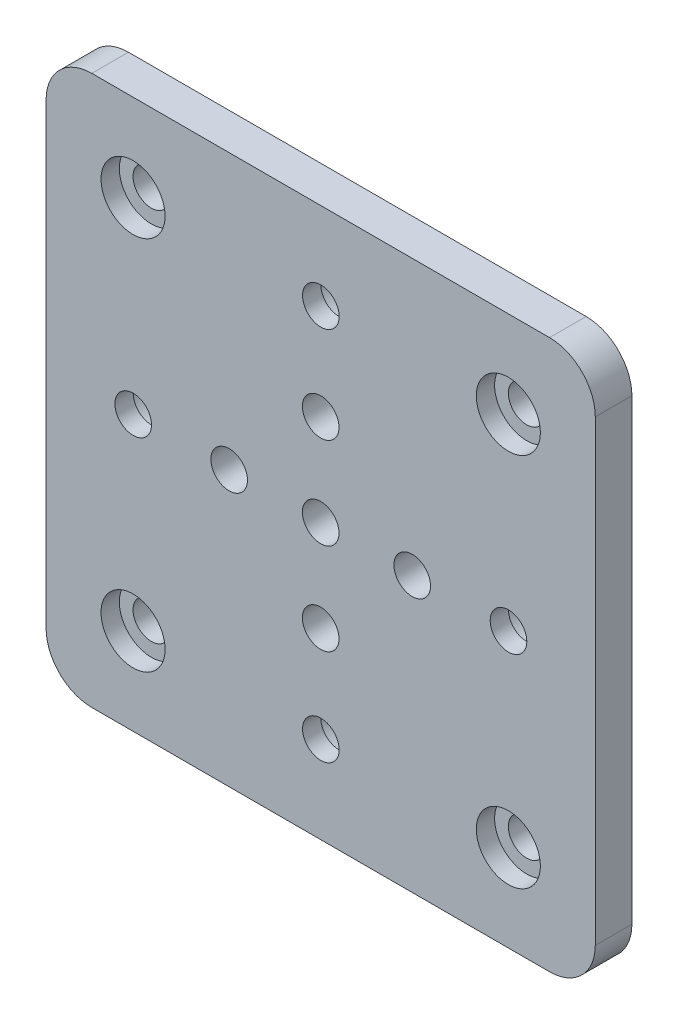
ISO-10303-21;
HEADER;
FILE_DESCRIPTION(('STEP AP214'),'2;1');
FILE_NAME('part.step','',(''),(''),'','','');
FILE_SCHEMA(('AUTOMOTIVE_DESIGN { 1 0 10303 214 1 1 1 1 }'));
ENDSEC;
DATA;
#1=APPLICATION_CONTEXT('core data for automotive mechanical design processes');
#2=APPLICATION_PROTOCOL_DEFINITION('international standard','automotive_design',2000,#1);
#3=PRODUCT_CONTEXT('',#1,'mechanical');
#4=PRODUCT('Part','Part','',(#3));
#5=PRODUCT_RELATED_PRODUCT_CATEGORY('part','',(#4));
#6=PRODUCT_DEFINITION_FORMATION('','',#4);
#7=PRODUCT_DEFINITION_CONTEXT('part definition',#1,'design');
#8=PRODUCT_DEFINITION('design','',#6,#7);
#9=PRODUCT_DEFINITION_SHAPE('','',#8);
#10=(LENGTH_UNIT() NAMED_UNIT(*) SI_UNIT(.MILLI.,.METRE.));
#11=(NAMED_UNIT(*) PLANE_ANGLE_UNIT() SI_UNIT($,.RADIAN.));
#12=(NAMED_UNIT(*) SI_UNIT($,.STERADIAN.) SOLID_ANGLE_UNIT());
#13=UNCERTAINTY_MEASURE_WITH_UNIT(LENGTH_MEASURE(1.E-05),#10,'distance_accuracy_value','');
#14=(GEOMETRIC_REPRESENTATION_CONTEXT(3) GLOBAL_UNCERTAINTY_ASSIGNED_CONTEXT((#13)) GLOBAL_UNIT_ASSIGNED_CONTEXT((#10,
#11,#12)) REPRESENTATION_CONTEXT('',''));
#15=CARTESIAN_POINT('',(0.,0.,0.));
#16=DIRECTION('',(0.,0.,1.));
#17=DIRECTION('',(1.,0.,0.));
#18=AXIS2_PLACEMENT_3D('',#15,#16,#17);
#19=CARTESIAN_POINT('',(20.5000070998357,0.,4.));
#20=DIRECTION('',(0.,0.,-1.));
#21=DIRECTION('',(-1.,0.,0.));
#22=AXIS2_PLACEMENT_3D('',#19,#20,#21);
#23=CYLINDRICAL_SURFACE('',#22,2.);
#24=CARTESIAN_POINT('',(20.5000070998357,0.,4.));
#25=DIRECTION('',(0.,0.,1.));
#26=DIRECTION('',(1.,0.,0.));
#27=AXIS2_PLACEMENT_3D('',#24,#25,#26);
#28=CIRCLE('',#27,2.);
#29=CARTESIAN_POINT('',(22.5000070998357,0.,4.));
#30=VERTEX_POINT('',#29);
#31=EDGE_CURVE('E155',#30,#30,#28,.T.);
#32=ORIENTED_EDGE('',*,*,#31,.T.);
#33=EDGE_LOOP('',(#32));
#34=FACE_BOUND('',#33,.T.);
#35=CARTESIAN_POINT('',(20.5000070998357,0.,2.));
#36=DIRECTION('',(0.,0.,-1.));
#37=DIRECTION('',(-1.,0.,0.));
#38=AXIS2_PLACEMENT_3D('',#35,#36,#37);
#39=CIRCLE('',#38,2.);
#40=CARTESIAN_POINT('',(18.5000070998357,0.,2.));
#41=VERTEX_POINT('',#40);
#42=EDGE_CURVE('E49',#41,#41,#39,.T.);
#43=ORIENTED_EDGE('',*,*,#42,.T.);
#44=EDGE_LOOP('',(#43));
#45=FACE_BOUND('',#44,.T.);
#46=ADVANCED_FACE('F45',(#34,#45),#23,.F.);
#47=CARTESIAN_POINT('',(0.,-20.5000070998356,4.));
#48=DIRECTION('',(0.,0.,-1.));
#49=DIRECTION('',(-1.,0.,0.));
#50=AXIS2_PLACEMENT_3D('',#47,#48,#49);
#51=CYLINDRICAL_SURFACE('',#50,2.);
#52=CARTESIAN_POINT('',(0.,-20.5000070998356,4.));
#53=DIRECTION('',(0.,0.,1.));
#54=DIRECTION('',(1.,0.,0.));
#55=AXIS2_PLACEMENT_3D('',#52,#53,#54);
#56=CIRCLE('',#55,2.);
#57=CARTESIAN_POINT('',(2.,-20.5000070998356,4.));
#58=VERTEX_POINT('',#57);
#59=EDGE_CURVE('E310',#58,#58,#56,.T.);
#60=ORIENTED_EDGE('',*,*,#59,.T.);
#61=EDGE_LOOP('',(#60));
#62=FACE_BOUND('',#61,.T.);
#63=CARTESIAN_POINT('',(0.,-20.5000070998356,2.));
#64=DIRECTION('',(0.,0.,-1.));
#65=DIRECTION('',(-1.,0.,0.));
#66=AXIS2_PLACEMENT_3D('',#63,#64,#65);
#67=CIRCLE('',#66,2.);
#68=CARTESIAN_POINT('',(-2.,-20.5000070998356,2.));
#69=VERTEX_POINT('',#68);
#70=EDGE_CURVE('E217',#69,#69,#67,.T.);
#71=ORIENTED_EDGE('',*,*,#70,.T.);
#72=EDGE_LOOP('',(#71));
#73=FACE_BOUND('',#72,.T.);
#74=ADVANCED_FACE('F433',(#62,#73),#51,.F.);
#75=CARTESIAN_POINT('',(0.,20.4999929001644,4.));
#76=DIRECTION('',(0.,0.,-1.));
#77=DIRECTION('',(-1.,0.,0.));
#78=AXIS2_PLACEMENT_3D('',#75,#76,#77);
#79=CYLINDRICAL_SURFACE('',#78,2.);
#80=CARTESIAN_POINT('',(0.,20.4999929001644,4.));
#81=DIRECTION('',(0.,0.,1.));
#82=DIRECTION('',(1.,0.,0.));
#83=AXIS2_PLACEMENT_3D('',#80,#81,#82);
#84=CIRCLE('',#83,2.);
#85=CARTESIAN_POINT('',(2.,20.4999929001644,4.));
#86=VERTEX_POINT('',#85);
#87=EDGE_CURVE('E302',#86,#86,#84,.T.);
#88=ORIENTED_EDGE('',*,*,#87,.T.);
#89=EDGE_LOOP('',(#88));
#90=FACE_BOUND('',#89,.T.);
#91=CARTESIAN_POINT('',(0.,20.4999929001644,2.));
#92=DIRECTION('',(0.,0.,-1.));
#93=DIRECTION('',(-1.,0.,0.));
#94=AXIS2_PLACEMENT_3D('',#91,#92,#93);
#95=CIRCLE('',#94,2.);
#96=CARTESIAN_POINT('',(-2.,20.4999929001644,2.));
#97=VERTEX_POINT('',#96);
#98=EDGE_CURVE('E213',#97,#97,#95,.T.);
#99=ORIENTED_EDGE('',*,*,#98,.T.);
#100=EDGE_LOOP('',(#99));
#101=FACE_BOUND('',#100,.T.);
#102=ADVANCED_FACE('F440',(#90,#101),#79,.F.);
#103=CARTESIAN_POINT('',(-20.5,0.,4.));
#104=DIRECTION('',(0.,0.,-1.));
#105=DIRECTION('',(-1.,0.,0.));
#106=AXIS2_PLACEMENT_3D('',#103,#104,#105);
#107=CYLINDRICAL_SURFACE('',#106,2.);
#108=CARTESIAN_POINT('',(-20.5,0.,4.));
#109=DIRECTION('',(0.,0.,1.));
#110=DIRECTION('',(1.,0.,0.));
#111=AXIS2_PLACEMENT_3D('',#108,#109,#110);
#112=CIRCLE('',#111,2.);
#113=CARTESIAN_POINT('',(-18.5,0.,4.));
#114=VERTEX_POINT('',#113);
#115=EDGE_CURVE('E295',#114,#114,#112,.T.);
#116=ORIENTED_EDGE('',*,*,#115,.T.);
#117=EDGE_LOOP('',(#116));
#118=FACE_BOUND('',#117,.T.);
#119=CARTESIAN_POINT('',(-20.5,0.,2.));
#120=DIRECTION('',(0.,0.,-1.));
#121=DIRECTION('',(-1.,0.,0.));
#122=AXIS2_PLACEMENT_3D('',#119,#120,#121);
#123=CIRCLE('',#122,2.);
#124=CARTESIAN_POINT('',(-22.5,0.,2.));
#125=VERTEX_POINT('',#124);
#126=EDGE_CURVE('E209',#125,#125,#123,.T.);
#127=ORIENTED_EDGE('',*,*,#126,.T.);
#128=EDGE_LOOP('',(#127));
#129=FACE_BOUND('',#128,.T.);
#130=ADVANCED_FACE('F604',(#118,#129),#107,.F.);
#131=CARTESIAN_POINT('',(-20.5170614570448,20.4999929001644,4.));
#132=DIRECTION('',(0.,0.,-1.));
#133=DIRECTION('',(-1.,0.,0.));
#134=AXIS2_PLACEMENT_3D('',#131,#132,#133);
#135=CYLINDRICAL_SURFACE('',#134,2.);
#136=CARTESIAN_POINT('',(-20.5170614570448,20.4999929001644,0.));
#137=DIRECTION('',(0.,0.,1.));
#138=DIRECTION('',(1.,0.,0.));
#139=AXIS2_PLACEMENT_3D('',#136,#137,#138);
#140=CIRCLE('',#139,2.);
#141=CARTESIAN_POINT('',(-18.5170614570448,20.4999929001644,0.));
#142=VERTEX_POINT('',#141);
#143=EDGE_CURVE('E306',#142,#142,#140,.T.);
#144=ORIENTED_EDGE('',*,*,#143,.F.);
#145=EDGE_LOOP('',(#144));
#146=FACE_BOUND('',#145,.T.);
#147=CARTESIAN_POINT('',(-20.5170614570448,20.4999929001644,2.));
#148=DIRECTION('',(0.,0.,1.));
#149=DIRECTION('',(1.,0.,0.));
#150=AXIS2_PLACEMENT_3D('',#147,#148,#149);
#151=CIRCLE('',#150,2.);
#152=CARTESIAN_POINT('',(-18.5170614570448,20.4999929001644,2.));
#153=VERTEX_POINT('',#152);
#154=EDGE_CURVE('E204',#153,#153,#151,.T.);
#155=ORIENTED_EDGE('',*,*,#154,.T.);
#156=EDGE_LOOP('',(#155));
#157=FACE_BOUND('',#156,.T.);
#158=ADVANCED_FACE('F596',(#146,#157),#135,.F.);
#159=CARTESIAN_POINT('',(20.4829385429551,-20.5000070998357,4.));
#160=DIRECTION('',(0.,0.,-1.));
#161=DIRECTION('',(-1.,0.,0.));
#162=AXIS2_PLACEMENT_3D('',#159,#160,#161);
#163=CYLINDRICAL_SURFACE('',#162,2.);
#164=CARTESIAN_POINT('',(20.4829385429551,-20.5000070998357,0.));
#165=DIRECTION('',(0.,0.,1.));
#166=DIRECTION('',(-1.,0.,0.));
#167=AXIS2_PLACEMENT_3D('',#164,#165,#166);
#168=CIRCLE('',#167,2.);
#169=CARTESIAN_POINT('',(18.4829385429551,-20.5000070998357,0.));
#170=VERTEX_POINT('',#169);
#171=EDGE_CURVE('E278',#170,#170,#168,.T.);
#172=ORIENTED_EDGE('',*,*,#171,.F.);
#173=EDGE_LOOP('',(#172));
#174=FACE_BOUND('',#173,.T.);
#175=CARTESIAN_POINT('',(20.4829385429551,-20.5000070998357,2.));
#176=DIRECTION('',(0.,0.,1.));
#177=DIRECTION('',(1.,0.,0.));
#178=AXIS2_PLACEMENT_3D('',#175,#176,#177);
#179=CIRCLE('',#178,2.);
#180=CARTESIAN_POINT('',(22.4829385429551,-20.5000070998357,2.));
#181=VERTEX_POINT('',#180);
#182=EDGE_CURVE('E200',#181,#181,#179,.T.);
#183=ORIENTED_EDGE('',*,*,#182,.T.);
#184=EDGE_LOOP('',(#183));
#185=FACE_BOUND('',#184,.T.);
#186=ADVANCED_FACE('F587',(#174,#185),#163,.F.);
#187=CARTESIAN_POINT('',(20.4829385429551,20.4999929001644,4.));
#188=DIRECTION('',(0.,0.,-1.));
#189=DIRECTION('',(-1.,0.,0.));
#190=AXIS2_PLACEMENT_3D('',#187,#188,#189);
#191=CYLINDRICAL_SURFACE('',#190,2.);
#192=CARTESIAN_POINT('',(20.4829385429551,20.4999929001644,0.));
#193=DIRECTION('',(0.,0.,1.));
#194=DIRECTION('',(1.,0.,0.));
#195=AXIS2_PLACEMENT_3D('',#192,#193,#194);
#196=CIRCLE('',#195,2.);
#197=CARTESIAN_POINT('',(22.4829385429551,20.4999929001644,0.));
#198=VERTEX_POINT('',#197);
#199=EDGE_CURVE('E274',#198,#198,#196,.T.);
#200=ORIENTED_EDGE('',*,*,#199,.F.);
#201=EDGE_LOOP('',(#200));
#202=FACE_BOUND('',#201,.T.);
#203=CARTESIAN_POINT('',(20.4829385429551,20.4999929001644,2.));
#204=DIRECTION('',(0.,0.,1.));
#205=DIRECTION('',(1.,0.,0.));
#206=AXIS2_PLACEMENT_3D('',#203,#204,#205);
#207=CIRCLE('',#206,2.);
#208=CARTESIAN_POINT('',(22.4829385429551,20.4999929001644,2.));
#209=VERTEX_POINT('',#208);
#210=EDGE_CURVE('E195',#209,#209,#207,.T.);
#211=ORIENTED_EDGE('',*,*,#210,.T.);
#212=EDGE_LOOP('',(#211));
#213=FACE_BOUND('',#212,.T.);
#214=ADVANCED_FACE('F578',(#202,#213),#191,.F.);
#215=CARTESIAN_POINT('',(-20.5170614570448,-20.5000070998356,4.));
#216=DIRECTION('',(0.,0.,-1.));
#217=DIRECTION('',(-1.,0.,0.));
#218=AXIS2_PLACEMENT_3D('',#215,#216,#217);
#219=CYLINDRICAL_SURFACE('',#218,2.);
#220=CARTESIAN_POINT('',(-20.5170614570448,-20.5000070998356,0.));
#221=DIRECTION('',(0.,0.,1.));
#222=DIRECTION('',(-1.,0.,0.));
#223=AXIS2_PLACEMENT_3D('',#220,#221,#222);
#224=CIRCLE('',#223,2.);
#225=CARTESIAN_POINT('',(-22.5170614570448,-20.5000070998356,0.));
#226=VERTEX_POINT('',#225);
#227=EDGE_CURVE('E267',#226,#226,#224,.T.);
#228=ORIENTED_EDGE('',*,*,#227,.F.);
#229=EDGE_LOOP('',(#228));
#230=FACE_BOUND('',#229,.T.);
#231=CARTESIAN_POINT('',(-20.5170614570448,-20.5000070998356,2.));
#232=DIRECTION('',(0.,0.,1.));
#233=DIRECTION('',(1.,0.,0.));
#234=AXIS2_PLACEMENT_3D('',#231,#232,#233);
#235=CIRCLE('',#234,2.);
#236=CARTESIAN_POINT('',(-18.5170614570448,-20.5000070998356,2.));
#237=VERTEX_POINT('',#236);
#238=EDGE_CURVE('E191',#237,#237,#235,.T.);
#239=ORIENTED_EDGE('',*,*,#238,.T.);
#240=EDGE_LOOP('',(#239));
#241=FACE_BOUND('',#240,.T.);
#242=ADVANCED_FACE('F446',(#230,#241),#219,.F.);
#243=CARTESIAN_POINT('',(24.9829385429552,-25.0000070998356,4.));
#244=DIRECTION('',(0.,0.,1.));
#245=DIRECTION('',(1.,0.,0.));
#246=AXIS2_PLACEMENT_3D('',#243,#244,#245);
#247=PLANE('',#246);
#248=CARTESIAN_POINT('',(20.4829385429551,20.4999929001644,4.));
#249=DIRECTION('',(0.,0.,1.));
#250=DIRECTION('',(1.,0.,0.));
#251=AXIS2_PLACEMENT_3D('',#248,#249,#250);
#252=CIRCLE('',#251,3.5);
#253=CARTESIAN_POINT('',(23.9829385429552,20.4999929001644,4.));
#254=VERTEX_POINT('',#253);
#255=EDGE_CURVE('E229',#254,#254,#252,.T.);
#256=ORIENTED_EDGE('',*,*,#255,.F.);
#257=EDGE_LOOP('',(#256));
#258=FACE_BOUND('',#257,.T.);
#259=CARTESIAN_POINT('',(20.4829385429551,-20.5000070998357,4.));
#260=DIRECTION('',(0.,0.,1.));
#261=DIRECTION('',(1.,0.,0.));
#262=AXIS2_PLACEMENT_3D('',#259,#260,#261);
#263=CIRCLE('',#262,3.5);
#264=CARTESIAN_POINT('',(23.9829385429552,-20.5000070998357,4.));
#265=VERTEX_POINT('',#264);
#266=EDGE_CURVE('E334',#265,#265,#263,.T.);
#267=ORIENTED_EDGE('',*,*,#266,.F.);
#268=EDGE_LOOP('',(#267));
#269=FACE_BOUND('',#268,.T.);
#270=CARTESIAN_POINT('',(-20.5170614570448,-20.5000070998356,4.));
#271=DIRECTION('',(0.,0.,1.));
#272=DIRECTION('',(1.,0.,0.));
#273=AXIS2_PLACEMENT_3D('',#270,#271,#272);
#274=CIRCLE('',#273,3.5);
#275=CARTESIAN_POINT('',(-17.0170614570448,-20.5000070998356,4.));
#276=VERTEX_POINT('',#275);
#277=EDGE_CURVE('E246',#276,#276,#274,.T.);
#278=ORIENTED_EDGE('',*,*,#277,.F.);
#279=EDGE_LOOP('',(#278));
#280=FACE_BOUND('',#279,.T.);
#281=CARTESIAN_POINT('',(-20.5170614570448,20.4999929001644,4.));
#282=DIRECTION('',(0.,0.,1.));
#283=DIRECTION('',(1.,0.,0.));
#284=AXIS2_PLACEMENT_3D('',#281,#282,#283);
#285=CIRCLE('',#284,3.5);
#286=CARTESIAN_POINT('',(-17.0170614570448,20.4999929001644,4.));
#287=VERTEX_POINT('',#286);
#288=EDGE_CURVE('E242',#287,#287,#285,.T.);
#289=ORIENTED_EDGE('',*,*,#288,.F.);
#290=EDGE_LOOP('',(#289));
#291=FACE_BOUND('',#290,.T.);
#292=CARTESIAN_POINT('',(9.98293854295517,0.,4.));
#293=DIRECTION('',(0.,0.,1.));
#294=DIRECTION('',(1.,0.,0.));
#295=AXIS2_PLACEMENT_3D('',#292,#293,#294);
#296=CIRCLE('',#295,2.);
#297=CARTESIAN_POINT('',(11.9829385429552,0.,4.));
#298=VERTEX_POINT('',#297);
#299=EDGE_CURVE('E255',#298,#298,#296,.T.);
#300=ORIENTED_EDGE('',*,*,#299,.F.);
#301=EDGE_LOOP('',(#300));
#302=FACE_BOUND('',#301,.T.);
#303=CARTESIAN_POINT('',(-10.0170614570448,0.,4.));
#304=DIRECTION('',(0.,0.,1.));
#305=DIRECTION('',(1.,0.,0.));
#306=AXIS2_PLACEMENT_3D('',#303,#304,#305);
#307=CIRCLE('',#306,2.);
#308=CARTESIAN_POINT('',(-8.01706145704483,0.,4.));
#309=VERTEX_POINT('',#308);
#310=EDGE_CURVE('E291',#309,#309,#307,.T.);
#311=ORIENTED_EDGE('',*,*,#310,.F.);
#312=EDGE_LOOP('',(#311));
#313=FACE_BOUND('',#312,.T.);
#314=ORIENTED_EDGE('',*,*,#87,.F.);
#315=EDGE_LOOP('',(#314));
#316=FACE_BOUND('',#315,.T.);
#317=ORIENTED_EDGE('',*,*,#59,.F.);
#318=EDGE_LOOP('',(#317));
#319=FACE_BOUND('',#318,.T.);
#320=CARTESIAN_POINT('',(24.9829385429552,-25.0000070998356,4.));
#321=DIRECTION('',(0.,0.,1.));
#322=DIRECTION('',(1.,0.,0.));
#323=AXIS2_PLACEMENT_3D('',#320,#321,#322);
#324=CIRCLE('',#323,5.);
#325=CARTESIAN_POINT('',(24.9829385429552,-30.0000070998356,4.));
#326=VERTEX_POINT('',#325);
#327=CARTESIAN_POINT('',(29.9829385429552,-25.0000070998356,4.));
#328=VERTEX_POINT('',#327);
#329=EDGE_CURVE('E173',#326,#328,#324,.T.);
#330=ORIENTED_EDGE('',*,*,#329,.T.);
#331=DIRECTION('',(0.,1.,0.));
#332=VECTOR('',#331,1.);
#333=CARTESIAN_POINT('',(29.9829385429552,-25.0000070998356,4.));
#334=LINE('',#333,#332);
#335=CARTESIAN_POINT('',(29.9829385429552,24.9999929001644,4.));
#336=VERTEX_POINT('',#335);
#337=EDGE_CURVE('E108',#328,#336,#334,.T.);
#338=ORIENTED_EDGE('',*,*,#337,.T.);
#339=CARTESIAN_POINT('',(24.9829385429552,24.9999929001644,4.));
#340=DIRECTION('',(0.,0.,1.));
#341=DIRECTION('',(1.,0.,0.));
#342=AXIS2_PLACEMENT_3D('',#339,#340,#341);
#343=CIRCLE('',#342,5.);
#344=CARTESIAN_POINT('',(24.9829385429552,29.9999929001644,4.));
#345=VERTEX_POINT('',#344);
#346=EDGE_CURVE('E321',#336,#345,#343,.T.);
#347=ORIENTED_EDGE('',*,*,#346,.T.);
#348=DIRECTION('',(-1.,0.,0.));
#349=VECTOR('',#348,1.);
#350=CARTESIAN_POINT('',(24.9829385429552,29.9999929001644,4.));
#351=LINE('',#350,#349);
#352=CARTESIAN_POINT('',(-25.0170614570448,29.9999929001644,4.));
#353=VERTEX_POINT('',#352);
#354=EDGE_CURVE('E324',#345,#353,#351,.T.);
#355=ORIENTED_EDGE('',*,*,#354,.T.);
#356=CARTESIAN_POINT('',(-25.0170614570448,24.9999929001644,4.));
#357=DIRECTION('',(0.,0.,1.));
#358=DIRECTION('',(1.,0.,0.));
#359=AXIS2_PLACEMENT_3D('',#356,#357,#358);
#360=CIRCLE('',#359,5.);
#361=CARTESIAN_POINT('',(-30.0170614570448,24.9999929001644,4.));
#362=VERTEX_POINT('',#361);
#363=EDGE_CURVE('E128',#353,#362,#360,.T.);
#364=ORIENTED_EDGE('',*,*,#363,.T.);
#365=DIRECTION('',(0.,-1.,0.));
#366=VECTOR('',#365,1.);
#367=CARTESIAN_POINT('',(-30.0170614570448,24.9999929001644,4.));
#368=LINE('',#367,#366);
#369=CARTESIAN_POINT('',(-30.0170614570448,-25.0000070998357,4.));
#370=VERTEX_POINT('',#369);
#371=EDGE_CURVE('E121',#362,#370,#368,.T.);
#372=ORIENTED_EDGE('',*,*,#371,.T.);
#373=CARTESIAN_POINT('',(-25.0170614570448,-25.0000070998357,4.));
#374=DIRECTION('',(0.,0.,1.));
#375=DIRECTION('',(1.,0.,0.));
#376=AXIS2_PLACEMENT_3D('',#373,#374,#375);
#377=CIRCLE('',#376,4.99999999999999);
#378=CARTESIAN_POINT('',(-25.0170614570448,-30.0000070998356,4.));
#379=VERTEX_POINT('',#378);
#380=EDGE_CURVE('E126',#370,#379,#377,.T.);
#381=ORIENTED_EDGE('',*,*,#380,.T.);
#382=DIRECTION('',(1.,0.,0.));
#383=VECTOR('',#382,1.);
#384=CARTESIAN_POINT('',(-25.0170614570448,-30.0000070998356,4.));
#385=LINE('',#384,#383);
#386=EDGE_CURVE('E65',#379,#326,#385,.T.);
#387=ORIENTED_EDGE('',*,*,#386,.T.);
#388=EDGE_LOOP('',(#330,#338,#347,#355,#364,#372,#381,#387));
#389=FACE_BOUND('',#388,.T.);
#390=ORIENTED_EDGE('',*,*,#31,.F.);
#391=EDGE_LOOP('',(#390));
#392=FACE_BOUND('',#391,.T.);
#393=ORIENTED_EDGE('',*,*,#115,.F.);
#394=EDGE_LOOP('',(#393));
#395=FACE_BOUND('',#394,.T.);
#396=CARTESIAN_POINT('',(-0.0170614570448352,0.,4.));
#397=DIRECTION('',(0.,0.,1.));
#398=DIRECTION('',(1.,0.,0.));
#399=AXIS2_PLACEMENT_3D('',#396,#397,#398);
#400=CIRCLE('',#399,2.);
#401=CARTESIAN_POINT('',(1.98293854295516,0.,4.));
#402=VERTEX_POINT('',#401);
#403=EDGE_CURVE('E283',#402,#402,#400,.T.);
#404=ORIENTED_EDGE('',*,*,#403,.F.);
#405=EDGE_LOOP('',(#404));
#406=FACE_BOUND('',#405,.T.);
#407=CARTESIAN_POINT('',(-0.0170614570448326,10.,4.));
#408=DIRECTION('',(0.,0.,1.));
#409=DIRECTION('',(1.,0.,0.));
#410=AXIS2_PLACEMENT_3D('',#407,#408,#409);
#411=CIRCLE('',#410,2.);
#412=CARTESIAN_POINT('',(1.98293854295517,10.,4.));
#413=VERTEX_POINT('',#412);
#414=EDGE_CURVE('E263',#413,#413,#411,.T.);
#415=ORIENTED_EDGE('',*,*,#414,.F.);
#416=EDGE_LOOP('',(#415));
#417=FACE_BOUND('',#416,.T.);
#418=CARTESIAN_POINT('',(-0.0170614570448326,-10.,4.));
#419=DIRECTION('',(0.,0.,1.));
#420=DIRECTION('',(1.,0.,0.));
#421=AXIS2_PLACEMENT_3D('',#418,#419,#420);
#422=CIRCLE('',#421,2.);
#423=CARTESIAN_POINT('',(1.98293854295517,-10.,4.));
#424=VERTEX_POINT('',#423);
#425=EDGE_CURVE('E247',#424,#424,#422,.T.);
#426=ORIENTED_EDGE('',*,*,#425,.F.);
#427=EDGE_LOOP('',(#426));
#428=FACE_BOUND('',#427,.T.);
#429=ADVANCED_FACE('F123',(#258,#269,#280,#291,#302,#313,#316,#319,#389,#392,#395,#406,#417,
#428),#247,.T.);
#430=CARTESIAN_POINT('',(24.9829385429552,-25.0000070998356,0.));
#431=DIRECTION('',(0.,0.,1.));
#432=DIRECTION('',(1.,0.,0.));
#433=AXIS2_PLACEMENT_3D('',#430,#431,#432);
#434=PLANE('',#433);
#435=CARTESIAN_POINT('',(20.5000070998357,0.,0.));
#436=DIRECTION('',(0.,0.,-1.));
#437=DIRECTION('',(-1.,0.,0.));
#438=AXIS2_PLACEMENT_3D('',#435,#436,#437);
#439=CIRCLE('',#438,3.5);
#440=CARTESIAN_POINT('',(17.0000070998357,0.,0.));
#441=VERTEX_POINT('',#440);
#442=EDGE_CURVE('E367',#441,#441,#439,.T.);
#443=ORIENTED_EDGE('',*,*,#442,.F.);
#444=EDGE_LOOP('',(#443));
#445=FACE_BOUND('',#444,.T.);
#446=CARTESIAN_POINT('',(-20.5,0.,0.));
#447=DIRECTION('',(0.,0.,-1.));
#448=DIRECTION('',(-1.,0.,0.));
#449=AXIS2_PLACEMENT_3D('',#446,#447,#448);
#450=CIRCLE('',#449,3.5);
#451=CARTESIAN_POINT('',(-24.,0.,0.));
#452=VERTEX_POINT('',#451);
#453=EDGE_CURVE('E363',#452,#452,#450,.T.);
#454=ORIENTED_EDGE('',*,*,#453,.F.);
#455=EDGE_LOOP('',(#454));
#456=FACE_BOUND('',#455,.T.);
#457=CARTESIAN_POINT('',(0.,20.4999929001644,0.));
#458=DIRECTION('',(0.,0.,-1.));
#459=DIRECTION('',(-1.,0.,0.));
#460=AXIS2_PLACEMENT_3D('',#457,#458,#459);
#461=CIRCLE('',#460,3.5);
#462=CARTESIAN_POINT('',(-3.5,20.4999929001644,0.));
#463=VERTEX_POINT('',#462);
#464=EDGE_CURVE('E355',#463,#463,#461,.T.);
#465=ORIENTED_EDGE('',*,*,#464,.F.);
#466=EDGE_LOOP('',(#465));
#467=FACE_BOUND('',#466,.T.);
#468=CARTESIAN_POINT('',(0.,-20.5000070998356,0.));
#469=DIRECTION('',(0.,0.,-1.));
#470=DIRECTION('',(-1.,0.,0.));
#471=AXIS2_PLACEMENT_3D('',#468,#469,#470);
#472=CIRCLE('',#471,3.5);
#473=CARTESIAN_POINT('',(-3.5,-20.5000070998356,0.));
#474=VERTEX_POINT('',#473);
#475=EDGE_CURVE('E347',#474,#474,#472,.T.);
#476=ORIENTED_EDGE('',*,*,#475,.F.);
#477=EDGE_LOOP('',(#476));
#478=FACE_BOUND('',#477,.T.);
#479=CARTESIAN_POINT('',(24.9829385429552,-25.0000070998356,0.));
#480=DIRECTION('',(0.,0.,1.));
#481=DIRECTION('',(1.,0.,0.));
#482=AXIS2_PLACEMENT_3D('',#479,#480,#481);
#483=CIRCLE('',#482,5.);
#484=CARTESIAN_POINT('',(24.9829385429552,-30.0000070998356,0.));
#485=VERTEX_POINT('',#484);
#486=CARTESIAN_POINT('',(29.9829385429552,-25.0000070998356,0.));
#487=VERTEX_POINT('',#486);
#488=EDGE_CURVE('E150',#485,#487,#483,.T.);
#489=ORIENTED_EDGE('',*,*,#488,.F.);
#490=DIRECTION('',(1.,0.,0.));
#491=VECTOR('',#490,1.);
#492=CARTESIAN_POINT('',(-25.0170614570448,-30.0000070998356,0.));
#493=LINE('',#492,#491);
#494=CARTESIAN_POINT('',(-25.0170614570448,-30.0000070998356,0.));
#495=VERTEX_POINT('',#494);
#496=EDGE_CURVE('E100',#495,#485,#493,.T.);
#497=ORIENTED_EDGE('',*,*,#496,.F.);
#498=CARTESIAN_POINT('',(-25.0170614570448,-25.0000070998357,0.));
#499=DIRECTION('',(0.,0.,1.));
#500=DIRECTION('',(1.,0.,0.));
#501=AXIS2_PLACEMENT_3D('',#498,#499,#500);
#502=CIRCLE('',#501,4.99999999999999);
#503=CARTESIAN_POINT('',(-30.0170614570448,-25.0000070998357,0.));
#504=VERTEX_POINT('',#503);
#505=EDGE_CURVE('E94',#504,#495,#502,.T.);
#506=ORIENTED_EDGE('',*,*,#505,.F.);
#507=DIRECTION('',(0.,-1.,0.));
#508=VECTOR('',#507,1.);
#509=CARTESIAN_POINT('',(-30.0170614570448,24.9999929001644,0.));
#510=LINE('',#509,#508);
#511=CARTESIAN_POINT('',(-30.0170614570448,24.9999929001644,0.));
#512=VERTEX_POINT('',#511);
#513=EDGE_CURVE('E137',#512,#504,#510,.T.);
#514=ORIENTED_EDGE('',*,*,#513,.F.);
#515=CARTESIAN_POINT('',(-25.0170614570448,24.9999929001644,0.));
#516=DIRECTION('',(0.,0.,1.));
#517=DIRECTION('',(1.,0.,0.));
#518=AXIS2_PLACEMENT_3D('',#515,#516,#517);
#519=CIRCLE('',#518,5.);
#520=CARTESIAN_POINT('',(-25.0170614570448,29.9999929001644,0.));
#521=VERTEX_POINT('',#520);
#522=EDGE_CURVE('E164',#521,#512,#519,.T.);
#523=ORIENTED_EDGE('',*,*,#522,.F.);
#524=DIRECTION('',(-1.,0.,0.));
#525=VECTOR('',#524,1.);
#526=CARTESIAN_POINT('',(24.9829385429552,29.9999929001644,0.));
#527=LINE('',#526,#525);
#528=CARTESIAN_POINT('',(24.9829385429552,29.9999929001644,0.));
#529=VERTEX_POINT('',#528);
#530=EDGE_CURVE('E161',#529,#521,#527,.T.);
#531=ORIENTED_EDGE('',*,*,#530,.F.);
#532=CARTESIAN_POINT('',(24.9829385429552,24.9999929001644,0.));
#533=DIRECTION('',(0.,0.,1.));
#534=DIRECTION('',(1.,0.,0.));
#535=AXIS2_PLACEMENT_3D('',#532,#533,#534);
#536=CIRCLE('',#535,5.);
#537=CARTESIAN_POINT('',(29.9829385429552,24.9999929001644,0.));
#538=VERTEX_POINT('',#537);
#539=EDGE_CURVE('E158',#538,#529,#536,.T.);
#540=ORIENTED_EDGE('',*,*,#539,.F.);
#541=DIRECTION('',(0.,1.,0.));
#542=VECTOR('',#541,1.);
#543=CARTESIAN_POINT('',(29.9829385429552,-25.0000070998356,0.));
#544=LINE('',#543,#542);
#545=EDGE_CURVE('E154',#487,#538,#544,.T.);
#546=ORIENTED_EDGE('',*,*,#545,.F.);
#547=EDGE_LOOP('',(#489,#497,#506,#514,#523,#531,#540,#546));
#548=FACE_BOUND('',#547,.T.);
#549=ORIENTED_EDGE('',*,*,#143,.T.);
#550=EDGE_LOOP('',(#549));
#551=FACE_BOUND('',#550,.T.);
#552=CARTESIAN_POINT('',(-10.0170614570448,0.,0.));
#553=DIRECTION('',(0.,0.,1.));
#554=DIRECTION('',(1.,0.,0.));
#555=AXIS2_PLACEMENT_3D('',#552,#553,#554);
#556=CIRCLE('',#555,2.);
#557=CARTESIAN_POINT('',(-8.01706145704483,0.,0.));
#558=VERTEX_POINT('',#557);
#559=EDGE_CURVE('E287',#558,#558,#556,.T.);
#560=ORIENTED_EDGE('',*,*,#559,.T.);
#561=EDGE_LOOP('',(#560));
#562=FACE_BOUND('',#561,.T.);
#563=CARTESIAN_POINT('',(-0.0170614570448352,0.,0.));
#564=DIRECTION('',(0.,0.,1.));
#565=DIRECTION('',(1.,0.,0.));
#566=AXIS2_PLACEMENT_3D('',#563,#564,#565);
#567=CIRCLE('',#566,2.);
#568=CARTESIAN_POINT('',(1.98293854295516,0.,0.));
#569=VERTEX_POINT('',#568);
#570=EDGE_CURVE('E282',#569,#569,#567,.T.);
#571=ORIENTED_EDGE('',*,*,#570,.T.);
#572=EDGE_LOOP('',(#571));
#573=FACE_BOUND('',#572,.T.);
#574=ORIENTED_EDGE('',*,*,#171,.T.);
#575=EDGE_LOOP('',(#574));
#576=FACE_BOUND('',#575,.T.);
#577=ORIENTED_EDGE('',*,*,#199,.T.);
#578=EDGE_LOOP('',(#577));
#579=FACE_BOUND('',#578,.T.);
#580=ORIENTED_EDGE('',*,*,#227,.T.);
#581=EDGE_LOOP('',(#580));
#582=FACE_BOUND('',#581,.T.);
#583=CARTESIAN_POINT('',(-0.0170614570448326,10.,0.));
#584=DIRECTION('',(0.,0.,1.));
#585=DIRECTION('',(1.,0.,0.));
#586=AXIS2_PLACEMENT_3D('',#583,#584,#585);
#587=CIRCLE('',#586,2.);
#588=CARTESIAN_POINT('',(1.98293854295517,10.,0.));
#589=VERTEX_POINT('',#588);
#590=EDGE_CURVE('E259',#589,#589,#587,.T.);
#591=ORIENTED_EDGE('',*,*,#590,.T.);
#592=EDGE_LOOP('',(#591));
#593=FACE_BOUND('',#592,.T.);
#594=CARTESIAN_POINT('',(9.98293854295517,0.,0.));
#595=DIRECTION('',(0.,0.,1.));
#596=DIRECTION('',(1.,0.,0.));
#597=AXIS2_PLACEMENT_3D('',#594,#595,#596);
#598=CIRCLE('',#597,2.);
#599=CARTESIAN_POINT('',(11.9829385429552,0.,0.));
#600=VERTEX_POINT('',#599);
#601=EDGE_CURVE('E251',#600,#600,#598,.T.);
#602=ORIENTED_EDGE('',*,*,#601,.T.);
#603=EDGE_LOOP('',(#602));
#604=FACE_BOUND('',#603,.T.);
#605=CARTESIAN_POINT('',(-0.0170614570448326,-10.,0.));
#606=DIRECTION('',(0.,0.,1.));
#607=DIRECTION('',(1.,0.,0.));
#608=AXIS2_PLACEMENT_3D('',#605,#606,#607);
#609=CIRCLE('',#608,2.);
#610=CARTESIAN_POINT('',(1.98293854295517,-10.,0.));
#611=VERTEX_POINT('',#610);
#612=EDGE_CURVE('E208',#611,#611,#609,.T.);
#613=ORIENTED_EDGE('',*,*,#612,.T.);
#614=EDGE_LOOP('',(#613));
#615=FACE_BOUND('',#614,.T.);
#616=ADVANCED_FACE('F384',(#445,#456,#467,#478,#548,#551,#562,#573,#576,#579,#582,#593,#604,
#615),#434,.F.);
#617=CARTESIAN_POINT('',(24.9829385429552,-25.0000070998356,4.));
#618=DIRECTION('',(0.,0.,-1.));
#619=DIRECTION('',(-1.,0.,0.));
#620=AXIS2_PLACEMENT_3D('',#617,#618,#619);
#621=CYLINDRICAL_SURFACE('',#620,5.);
#622=ORIENTED_EDGE('',*,*,#488,.T.);
#623=DIRECTION('',(0.,0.,-1.));
#624=VECTOR('',#623,1.);
#625=CARTESIAN_POINT('',(29.9829385429552,-25.0000070998356,4.));
#626=LINE('',#625,#624);
#627=EDGE_CURVE('E11',#328,#487,#626,.T.);
#628=ORIENTED_EDGE('',*,*,#627,.F.);
#629=ORIENTED_EDGE('',*,*,#329,.F.);
#630=DIRECTION('',(0.,0.,-1.));
#631=VECTOR('',#630,1.);
#632=CARTESIAN_POINT('',(24.9829385429552,-30.0000070998356,4.));
#633=LINE('',#632,#631);
#634=EDGE_CURVE('E146',#326,#485,#633,.T.);
#635=ORIENTED_EDGE('',*,*,#634,.T.);
#636=EDGE_LOOP('',(#622,#628,#629,#635));
#637=FACE_BOUND('',#636,.T.);
#638=ADVANCED_FACE('F47',(#637),#621,.T.);
#639=CARTESIAN_POINT('',(29.9829385429552,-25.0000070998356,4.));
#640=DIRECTION('',(-1.,0.,0.));
#641=DIRECTION('',(0.,-1.,0.));
#642=AXIS2_PLACEMENT_3D('',#639,#640,#641);
#643=PLANE('',#642);
#644=ORIENTED_EDGE('',*,*,#545,.T.);
#645=DIRECTION('',(0.,0.,-1.));
#646=VECTOR('',#645,1.);
#647=CARTESIAN_POINT('',(29.9829385429552,24.9999929001644,4.));
#648=LINE('',#647,#646);
#649=EDGE_CURVE('E56',#336,#538,#648,.T.);
#650=ORIENTED_EDGE('',*,*,#649,.F.);
#651=ORIENTED_EDGE('',*,*,#337,.F.);
#652=ORIENTED_EDGE('',*,*,#627,.T.);
#653=EDGE_LOOP('',(#644,#650,#651,#652));
#654=FACE_BOUND('',#653,.T.);
#655=ADVANCED_FACE('F467',(#654),#643,.F.);
#656=CARTESIAN_POINT('',(24.9829385429552,24.9999929001644,4.));
#657=DIRECTION('',(0.,0.,-1.));
#658=DIRECTION('',(-1.,0.,0.));
#659=AXIS2_PLACEMENT_3D('',#656,#657,#658);
#660=CYLINDRICAL_SURFACE('',#659,5.);
#661=ORIENTED_EDGE('',*,*,#539,.T.);
#662=DIRECTION('',(0.,0.,-1.));
#663=VECTOR('',#662,1.);
#664=CARTESIAN_POINT('',(24.9829385429552,29.9999929001644,4.));
#665=LINE('',#664,#663);
#666=EDGE_CURVE('E184',#345,#529,#665,.T.);
#667=ORIENTED_EDGE('',*,*,#666,.F.);
#668=ORIENTED_EDGE('',*,*,#346,.F.);
#669=ORIENTED_EDGE('',*,*,#649,.T.);
#670=EDGE_LOOP('',(#661,#667,#668,#669));
#671=FACE_BOUND('',#670,.T.);
#672=ADVANCED_FACE('F464',(#671),#660,.T.);
#673=CARTESIAN_POINT('',(24.9829385429552,29.9999929001644,4.));
#674=DIRECTION('',(0.,-1.,0.));
#675=DIRECTION('',(1.,0.,0.));
#676=AXIS2_PLACEMENT_3D('',#673,#674,#675);
#677=PLANE('',#676);
#678=ORIENTED_EDGE('',*,*,#530,.T.);
#679=DIRECTION('',(0.,0.,-1.));
#680=VECTOR('',#679,1.);
#681=CARTESIAN_POINT('',(-25.0170614570448,29.9999929001644,4.));
#682=LINE('',#681,#680);
#683=EDGE_CURVE('E180',#353,#521,#682,.T.);
#684=ORIENTED_EDGE('',*,*,#683,.F.);
#685=ORIENTED_EDGE('',*,*,#354,.F.);
#686=ORIENTED_EDGE('',*,*,#666,.T.);
#687=EDGE_LOOP('',(#678,#684,#685,#686));
#688=FACE_BOUND('',#687,.T.);
#689=ADVANCED_FACE('F460',(#688),#677,.F.);
#690=CARTESIAN_POINT('',(-25.0170614570448,24.9999929001644,4.));
#691=DIRECTION('',(0.,0.,-1.));
#692=DIRECTION('',(-1.,0.,0.));
#693=AXIS2_PLACEMENT_3D('',#690,#691,#692);
#694=CYLINDRICAL_SURFACE('',#693,5.);
#695=ORIENTED_EDGE('',*,*,#522,.T.);
#696=DIRECTION('',(0.,0.,-1.));
#697=VECTOR('',#696,1.);
#698=CARTESIAN_POINT('',(-30.0170614570448,24.9999929001644,4.));
#699=LINE('',#698,#697);
#700=EDGE_CURVE('E139',#362,#512,#699,.T.);
#701=ORIENTED_EDGE('',*,*,#700,.F.);
#702=ORIENTED_EDGE('',*,*,#363,.F.);
#703=ORIENTED_EDGE('',*,*,#683,.T.);
#704=EDGE_LOOP('',(#695,#701,#702,#703));
#705=FACE_BOUND('',#704,.T.);
#706=ADVANCED_FACE('F457',(#705),#694,.T.);
#707=CARTESIAN_POINT('',(-30.0170614570448,24.9999929001644,4.));
#708=DIRECTION('',(1.,0.,0.));
#709=DIRECTION('',(0.,0.,-1.));
#710=AXIS2_PLACEMENT_3D('',#707,#708,#709);
#711=PLANE('',#710);
#712=ORIENTED_EDGE('',*,*,#513,.T.);
#713=DIRECTION('',(0.,0.,-1.));
#714=VECTOR('',#713,1.);
#715=CARTESIAN_POINT('',(-30.0170614570448,-25.0000070998357,4.));
#716=LINE('',#715,#714);
#717=EDGE_CURVE('E134',#370,#504,#716,.T.);
#718=ORIENTED_EDGE('',*,*,#717,.F.);
#719=ORIENTED_EDGE('',*,*,#371,.F.);
#720=ORIENTED_EDGE('',*,*,#700,.T.);
#721=EDGE_LOOP('',(#712,#718,#719,#720));
#722=FACE_BOUND('',#721,.T.);
#723=ADVANCED_FACE('F135',(#722),#711,.F.);
#724=CARTESIAN_POINT('',(-25.0170614570448,-25.0000070998357,4.));
#725=DIRECTION('',(0.,0.,-1.));
#726=DIRECTION('',(-1.,0.,0.));
#727=AXIS2_PLACEMENT_3D('',#724,#725,#726);
#728=CYLINDRICAL_SURFACE('',#727,4.99999999999999);
#729=ORIENTED_EDGE('',*,*,#505,.T.);
#730=DIRECTION('',(0.,0.,-1.));
#731=VECTOR('',#730,1.);
#732=CARTESIAN_POINT('',(-25.0170614570448,-30.0000070998356,4.));
#733=LINE('',#732,#731);
#734=EDGE_CURVE('E140',#379,#495,#733,.T.);
#735=ORIENTED_EDGE('',*,*,#734,.F.);
#736=ORIENTED_EDGE('',*,*,#380,.F.);
#737=ORIENTED_EDGE('',*,*,#717,.T.);
#738=EDGE_LOOP('',(#729,#735,#736,#737));
#739=FACE_BOUND('',#738,.T.);
#740=ADVANCED_FACE('F142',(#739),#728,.T.);
#741=CARTESIAN_POINT('',(-25.0170614570448,-30.0000070998356,4.));
#742=DIRECTION('',(0.,1.,0.));
#743=DIRECTION('',(-1.,0.,0.));
#744=AXIS2_PLACEMENT_3D('',#741,#742,#743);
#745=PLANE('',#744);
#746=ORIENTED_EDGE('',*,*,#496,.T.);
#747=ORIENTED_EDGE('',*,*,#634,.F.);
#748=ORIENTED_EDGE('',*,*,#386,.F.);
#749=ORIENTED_EDGE('',*,*,#734,.T.);
#750=EDGE_LOOP('',(#746,#747,#748,#749));
#751=FACE_BOUND('',#750,.T.);
#752=ADVANCED_FACE('F449',(#751),#745,.F.);
#753=CARTESIAN_POINT('',(-10.0170614570448,0.,4.));
#754=DIRECTION('',(0.,0.,-1.));
#755=DIRECTION('',(-1.,0.,0.));
#756=AXIS2_PLACEMENT_3D('',#753,#754,#755);
#757=CYLINDRICAL_SURFACE('',#756,2.);
#758=ORIENTED_EDGE('',*,*,#310,.T.);
#759=EDGE_LOOP('',(#758));
#760=FACE_BOUND('',#759,.T.);
#761=ORIENTED_EDGE('',*,*,#559,.F.);
#762=EDGE_LOOP('',(#761));
#763=FACE_BOUND('',#762,.T.);
#764=ADVANCED_FACE('F452',(#760,#763),#757,.F.);
#765=CARTESIAN_POINT('',(-0.0170614570448352,0.,4.));
#766=DIRECTION('',(0.,0.,-1.));
#767=DIRECTION('',(-1.,0.,0.));
#768=AXIS2_PLACEMENT_3D('',#765,#766,#767);
#769=CYLINDRICAL_SURFACE('',#768,2.);
#770=ORIENTED_EDGE('',*,*,#403,.T.);
#771=EDGE_LOOP('',(#770));
#772=FACE_BOUND('',#771,.T.);
#773=ORIENTED_EDGE('',*,*,#570,.F.);
#774=EDGE_LOOP('',(#773));
#775=FACE_BOUND('',#774,.T.);
#776=ADVANCED_FACE('F540',(#772,#775),#769,.F.);
#777=CARTESIAN_POINT('',(-0.0170614570448326,10.,4.));
#778=DIRECTION('',(0.,0.,-1.));
#779=DIRECTION('',(-1.,0.,0.));
#780=AXIS2_PLACEMENT_3D('',#777,#778,#779);
#781=CYLINDRICAL_SURFACE('',#780,2.);
#782=ORIENTED_EDGE('',*,*,#414,.T.);
#783=EDGE_LOOP('',(#782));
#784=FACE_BOUND('',#783,.T.);
#785=ORIENTED_EDGE('',*,*,#590,.F.);
#786=EDGE_LOOP('',(#785));
#787=FACE_BOUND('',#786,.T.);
#788=ADVANCED_FACE('F428',(#784,#787),#781,.F.);
#789=CARTESIAN_POINT('',(9.98293854295517,0.,4.));
#790=DIRECTION('',(0.,0.,-1.));
#791=DIRECTION('',(-1.,0.,0.));
#792=AXIS2_PLACEMENT_3D('',#789,#790,#791);
#793=CYLINDRICAL_SURFACE('',#792,2.);
#794=ORIENTED_EDGE('',*,*,#299,.T.);
#795=EDGE_LOOP('',(#794));
#796=FACE_BOUND('',#795,.T.);
#797=ORIENTED_EDGE('',*,*,#601,.F.);
#798=EDGE_LOOP('',(#797));
#799=FACE_BOUND('',#798,.T.);
#800=ADVANCED_FACE('F417',(#796,#799),#793,.F.);
#801=CARTESIAN_POINT('',(-0.0170614570448326,-10.,4.));
#802=DIRECTION('',(0.,0.,-1.));
#803=DIRECTION('',(-1.,0.,0.));
#804=AXIS2_PLACEMENT_3D('',#801,#802,#803);
#805=CYLINDRICAL_SURFACE('',#804,2.);
#806=ORIENTED_EDGE('',*,*,#425,.T.);
#807=EDGE_LOOP('',(#806));
#808=FACE_BOUND('',#807,.T.);
#809=ORIENTED_EDGE('',*,*,#612,.F.);
#810=EDGE_LOOP('',(#809));
#811=FACE_BOUND('',#810,.T.);
#812=ADVANCED_FACE('F414',(#808,#811),#805,.F.);
#813=CARTESIAN_POINT('',(-20.5170614570448,-20.5000070998356,2.));
#814=DIRECTION('',(0.,0.,1.));
#815=DIRECTION('',(1.,0.,0.));
#816=AXIS2_PLACEMENT_3D('',#813,#814,#815);
#817=CYLINDRICAL_SURFACE('',#816,3.5);
#818=CARTESIAN_POINT('',(-20.5170614570448,-20.5000070998356,2.));
#819=DIRECTION('',(0.,0.,1.));
#820=DIRECTION('',(1.,0.,0.));
#821=AXIS2_PLACEMENT_3D('',#818,#819,#820);
#822=CIRCLE('',#821,3.5);
#823=CARTESIAN_POINT('',(-17.0170614570448,-20.5000070998356,2.));
#824=VERTEX_POINT('',#823);
#825=EDGE_CURVE('E330',#824,#824,#822,.T.);
#826=ORIENTED_EDGE('',*,*,#825,.F.);
#827=EDGE_LOOP('',(#826));
#828=FACE_BOUND('',#827,.T.);
#829=ORIENTED_EDGE('',*,*,#277,.T.);
#830=EDGE_LOOP('',(#829));
#831=FACE_BOUND('',#830,.T.);
#832=ADVANCED_FACE('F416',(#828,#831),#817,.F.);
#833=CARTESIAN_POINT('',(-20.5170614570448,-20.5000070998356,2.));
#834=DIRECTION('',(0.,0.,1.));
#835=DIRECTION('',(1.,0.,0.));
#836=AXIS2_PLACEMENT_3D('',#833,#834,#835);
#837=PLANE('',#836);
#838=ORIENTED_EDGE('',*,*,#238,.F.);
#839=EDGE_LOOP('',(#838));
#840=FACE_BOUND('',#839,.T.);
#841=ORIENTED_EDGE('',*,*,#825,.T.);
#842=EDGE_LOOP('',(#841));
#843=FACE_BOUND('',#842,.T.);
#844=ADVANCED_FACE('F425',(#840,#843),#837,.T.);
#845=CARTESIAN_POINT('',(20.4829385429551,20.4999929001644,2.));
#846=DIRECTION('',(0.,0.,1.));
#847=DIRECTION('',(1.,0.,0.));
#848=AXIS2_PLACEMENT_3D('',#845,#846,#847);
#849=CYLINDRICAL_SURFACE('',#848,3.5);
#850=CARTESIAN_POINT('',(20.4829385429551,20.4999929001644,2.));
#851=DIRECTION('',(0.,0.,1.));
#852=DIRECTION('',(1.,0.,0.));
#853=AXIS2_PLACEMENT_3D('',#850,#851,#852);
#854=CIRCLE('',#853,3.5);
#855=CARTESIAN_POINT('',(23.9829385429552,20.4999929001644,2.));
#856=VERTEX_POINT('',#855);
#857=EDGE_CURVE('E224',#856,#856,#854,.T.);
#858=ORIENTED_EDGE('',*,*,#857,.F.);
#859=EDGE_LOOP('',(#858));
#860=FACE_BOUND('',#859,.T.);
#861=ORIENTED_EDGE('',*,*,#255,.T.);
#862=EDGE_LOOP('',(#861));
#863=FACE_BOUND('',#862,.T.);
#864=ADVANCED_FACE('F618',(#860,#863),#849,.F.);
#865=CARTESIAN_POINT('',(20.4829385429551,20.4999929001644,2.));
#866=DIRECTION('',(0.,0.,1.));
#867=DIRECTION('',(1.,0.,0.));
#868=AXIS2_PLACEMENT_3D('',#865,#866,#867);
#869=PLANE('',#868);
#870=ORIENTED_EDGE('',*,*,#210,.F.);
#871=EDGE_LOOP('',(#870));
#872=FACE_BOUND('',#871,.T.);
#873=ORIENTED_EDGE('',*,*,#857,.T.);
#874=EDGE_LOOP('',(#873));
#875=FACE_BOUND('',#874,.T.);
#876=ADVANCED_FACE('F628',(#872,#875),#869,.T.);
#877=CARTESIAN_POINT('',(20.4829385429551,-20.5000070998357,2.));
#878=DIRECTION('',(0.,0.,1.));
#879=DIRECTION('',(1.,0.,0.));
#880=AXIS2_PLACEMENT_3D('',#877,#878,#879);
#881=CYLINDRICAL_SURFACE('',#880,3.5);
#882=CARTESIAN_POINT('',(20.4829385429551,-20.5000070998357,2.));
#883=DIRECTION('',(0.,0.,1.));
#884=DIRECTION('',(1.,0.,0.));
#885=AXIS2_PLACEMENT_3D('',#882,#883,#884);
#886=CIRCLE('',#885,3.5);
#887=CARTESIAN_POINT('',(23.9829385429552,-20.5000070998357,2.));
#888=VERTEX_POINT('',#887);
#889=EDGE_CURVE('E235',#888,#888,#886,.T.);
#890=ORIENTED_EDGE('',*,*,#889,.F.);
#891=EDGE_LOOP('',(#890));
#892=FACE_BOUND('',#891,.T.);
#893=ORIENTED_EDGE('',*,*,#266,.T.);
#894=EDGE_LOOP('',(#893));
#895=FACE_BOUND('',#894,.T.);
#896=ADVANCED_FACE('F638',(#892,#895),#881,.F.);
#897=CARTESIAN_POINT('',(20.4829385429551,-20.5000070998357,2.));
#898=DIRECTION('',(0.,0.,1.));
#899=DIRECTION('',(1.,0.,0.));
#900=AXIS2_PLACEMENT_3D('',#897,#898,#899);
#901=PLANE('',#900);
#902=ORIENTED_EDGE('',*,*,#182,.F.);
#903=EDGE_LOOP('',(#902));
#904=FACE_BOUND('',#903,.T.);
#905=ORIENTED_EDGE('',*,*,#889,.T.);
#906=EDGE_LOOP('',(#905));
#907=FACE_BOUND('',#906,.T.);
#908=ADVANCED_FACE('F648',(#904,#907),#901,.T.);
#909=CARTESIAN_POINT('',(-20.5170614570448,20.4999929001644,2.));
#910=DIRECTION('',(0.,0.,1.));
#911=DIRECTION('',(1.,0.,0.));
#912=AXIS2_PLACEMENT_3D('',#909,#910,#911);
#913=CYLINDRICAL_SURFACE('',#912,3.5);
#914=CARTESIAN_POINT('',(-20.5170614570448,20.4999929001644,2.));
#915=DIRECTION('',(0.,0.,1.));
#916=DIRECTION('',(1.,0.,0.));
#917=AXIS2_PLACEMENT_3D('',#914,#915,#916);
#918=CIRCLE('',#917,3.5);
#919=CARTESIAN_POINT('',(-17.0170614570448,20.4999929001644,2.));
#920=VERTEX_POINT('',#919);
#921=EDGE_CURVE('E196',#920,#920,#918,.T.);
#922=ORIENTED_EDGE('',*,*,#921,.F.);
#923=EDGE_LOOP('',(#922));
#924=FACE_BOUND('',#923,.T.);
#925=ORIENTED_EDGE('',*,*,#288,.T.);
#926=EDGE_LOOP('',(#925));
#927=FACE_BOUND('',#926,.T.);
#928=ADVANCED_FACE('F658',(#924,#927),#913,.F.);
#929=CARTESIAN_POINT('',(-20.5170614570448,20.4999929001644,2.));
#930=DIRECTION('',(0.,0.,1.));
#931=DIRECTION('',(1.,0.,0.));
#932=AXIS2_PLACEMENT_3D('',#929,#930,#931);
#933=PLANE('',#932);
#934=ORIENTED_EDGE('',*,*,#154,.F.);
#935=EDGE_LOOP('',(#934));
#936=FACE_BOUND('',#935,.T.);
#937=ORIENTED_EDGE('',*,*,#921,.T.);
#938=EDGE_LOOP('',(#937));
#939=FACE_BOUND('',#938,.T.);
#940=ADVANCED_FACE('F668',(#936,#939),#933,.T.);
#941=CARTESIAN_POINT('',(-20.5,0.,2.));
#942=DIRECTION('',(0.,0.,-1.));
#943=DIRECTION('',(-1.,0.,0.));
#944=AXIS2_PLACEMENT_3D('',#941,#942,#943);
#945=CYLINDRICAL_SURFACE('',#944,3.5);
#946=CARTESIAN_POINT('',(-20.5,0.,2.));
#947=DIRECTION('',(0.,0.,-1.));
#948=DIRECTION('',(-1.,0.,0.));
#949=AXIS2_PLACEMENT_3D('',#946,#947,#948);
#950=CIRCLE('',#949,3.5);
#951=CARTESIAN_POINT('',(-24.,0.,2.));
#952=VERTEX_POINT('',#951);
#953=EDGE_CURVE('E359',#952,#952,#950,.T.);
#954=ORIENTED_EDGE('',*,*,#953,.F.);
#955=EDGE_LOOP('',(#954));
#956=FACE_BOUND('',#955,.T.);
#957=ORIENTED_EDGE('',*,*,#453,.T.);
#958=EDGE_LOOP('',(#957));
#959=FACE_BOUND('',#958,.T.);
#960=ADVANCED_FACE('F676',(#956,#959),#945,.F.);
#961=CARTESIAN_POINT('',(-20.5,0.,2.));
#962=DIRECTION('',(0.,0.,-1.));
#963=DIRECTION('',(-1.,0.,0.));
#964=AXIS2_PLACEMENT_3D('',#961,#962,#963);
#965=PLANE('',#964);
#966=ORIENTED_EDGE('',*,*,#126,.F.);
#967=EDGE_LOOP('',(#966));
#968=FACE_BOUND('',#967,.T.);
#969=ORIENTED_EDGE('',*,*,#953,.T.);
#970=EDGE_LOOP('',(#969));
#971=FACE_BOUND('',#970,.T.);
#972=ADVANCED_FACE('F711',(#968,#971),#965,.T.);
#973=CARTESIAN_POINT('',(0.,20.4999929001644,2.));
#974=DIRECTION('',(0.,0.,-1.));
#975=DIRECTION('',(-1.,0.,0.));
#976=AXIS2_PLACEMENT_3D('',#973,#974,#975);
#977=CYLINDRICAL_SURFACE('',#976,3.5);
#978=CARTESIAN_POINT('',(0.,20.4999929001644,2.));
#979=DIRECTION('',(0.,0.,-1.));
#980=DIRECTION('',(-1.,0.,0.));
#981=AXIS2_PLACEMENT_3D('',#978,#979,#980);
#982=CIRCLE('',#981,3.5);
#983=CARTESIAN_POINT('',(-3.5,20.4999929001644,2.));
#984=VERTEX_POINT('',#983);
#985=EDGE_CURVE('E351',#984,#984,#982,.T.);
#986=ORIENTED_EDGE('',*,*,#985,.F.);
#987=EDGE_LOOP('',(#986));
#988=FACE_BOUND('',#987,.T.);
#989=ORIENTED_EDGE('',*,*,#464,.T.);
#990=EDGE_LOOP('',(#989));
#991=FACE_BOUND('',#990,.T.);
#992=ADVANCED_FACE('F721',(#988,#991),#977,.F.);
#993=CARTESIAN_POINT('',(0.,20.4999929001644,2.));
#994=DIRECTION('',(0.,0.,-1.));
#995=DIRECTION('',(-1.,0.,0.));
#996=AXIS2_PLACEMENT_3D('',#993,#994,#995);
#997=PLANE('',#996);
#998=ORIENTED_EDGE('',*,*,#98,.F.);
#999=EDGE_LOOP('',(#998));
#1000=FACE_BOUND('',#999,.T.);
#1001=ORIENTED_EDGE('',*,*,#985,.T.);
#1002=EDGE_LOOP('',(#1001));
#1003=FACE_BOUND('',#1002,.T.);
#1004=ADVANCED_FACE('F731',(#1000,#1003),#997,.T.);
#1005=CARTESIAN_POINT('',(0.,-20.5000070998356,2.));
#1006=DIRECTION('',(0.,0.,-1.));
#1007=DIRECTION('',(-1.,0.,0.));
#1008=AXIS2_PLACEMENT_3D('',#1005,#1006,#1007);
#1009=CYLINDRICAL_SURFACE('',#1008,3.5);
#1010=CARTESIAN_POINT('',(0.,-20.5000070998356,2.));
#1011=DIRECTION('',(0.,0.,-1.));
#1012=DIRECTION('',(-1.,0.,0.));
#1013=AXIS2_PLACEMENT_3D('',#1010,#1011,#1012);
#1014=CIRCLE('',#1013,3.5);
#1015=CARTESIAN_POINT('',(-3.5,-20.5000070998356,2.));
#1016=VERTEX_POINT('',#1015);
#1017=EDGE_CURVE('E343',#1016,#1016,#1014,.T.);
#1018=ORIENTED_EDGE('',*,*,#1017,.F.);
#1019=EDGE_LOOP('',(#1018));
#1020=FACE_BOUND('',#1019,.T.);
#1021=ORIENTED_EDGE('',*,*,#475,.T.);
#1022=EDGE_LOOP('',(#1021));
#1023=FACE_BOUND('',#1022,.T.);
#1024=ADVANCED_FACE('F741',(#1020,#1023),#1009,.F.);
#1025=CARTESIAN_POINT('',(0.,-20.5000070998356,2.));
#1026=DIRECTION('',(0.,0.,-1.));
#1027=DIRECTION('',(-1.,0.,0.));
#1028=AXIS2_PLACEMENT_3D('',#1025,#1026,#1027);
#1029=PLANE('',#1028);
#1030=ORIENTED_EDGE('',*,*,#70,.F.);
#1031=EDGE_LOOP('',(#1030));
#1032=FACE_BOUND('',#1031,.T.);
#1033=ORIENTED_EDGE('',*,*,#1017,.T.);
#1034=EDGE_LOOP('',(#1033));
#1035=FACE_BOUND('',#1034,.T.);
#1036=ADVANCED_FACE('F380',(#1032,#1035),#1029,.T.);
#1037=CARTESIAN_POINT('',(20.5000070998357,0.,2.));
#1038=DIRECTION('',(0.,0.,-1.));
#1039=DIRECTION('',(-1.,0.,0.));
#1040=AXIS2_PLACEMENT_3D('',#1037,#1038,#1039);
#1041=CYLINDRICAL_SURFACE('',#1040,3.5);
#1042=CARTESIAN_POINT('',(20.5000070998357,0.,2.));
#1043=DIRECTION('',(0.,0.,-1.));
#1044=DIRECTION('',(-1.,0.,0.));
#1045=AXIS2_PLACEMENT_3D('',#1042,#1043,#1044);
#1046=CIRCLE('',#1045,3.5);
#1047=CARTESIAN_POINT('',(17.0000070998357,0.,2.));
#1048=VERTEX_POINT('',#1047);
#1049=EDGE_CURVE('E214',#1048,#1048,#1046,.T.);
#1050=ORIENTED_EDGE('',*,*,#1049,.F.);
#1051=EDGE_LOOP('',(#1050));
#1052=FACE_BOUND('',#1051,.T.);
#1053=ORIENTED_EDGE('',*,*,#442,.T.);
#1054=EDGE_LOOP('',(#1053));
#1055=FACE_BOUND('',#1054,.T.);
#1056=ADVANCED_FACE('F377',(#1052,#1055),#1041,.F.);
#1057=CARTESIAN_POINT('',(20.5000070998357,0.,2.));
#1058=DIRECTION('',(0.,0.,-1.));
#1059=DIRECTION('',(-1.,0.,0.));
#1060=AXIS2_PLACEMENT_3D('',#1057,#1058,#1059);
#1061=PLANE('',#1060);
#1062=ORIENTED_EDGE('',*,*,#42,.F.);
#1063=EDGE_LOOP('',(#1062));
#1064=FACE_BOUND('',#1063,.T.);
#1065=ORIENTED_EDGE('',*,*,#1049,.T.);
#1066=EDGE_LOOP('',(#1065));
#1067=FACE_BOUND('',#1066,.T.);
#1068=ADVANCED_FACE('F375',(#1064,#1067),#1061,.T.);
#1069=CLOSED_SHELL('',(#46,#74,#102,#130,#158,#186,#214,#242,#429,#616,#638,#655,#672,#689,#706,
#723,#740,#752,#764,#776,#788,#800,#812,#832,#844,#864,#876,#896,#908,#928,#940,#960,#972,#992,
#1004,#1024,#1036,#1056,#1068));
#1070=MANIFOLD_SOLID_BREP('B2',#1069);
#1071=ADVANCED_BREP_SHAPE_REPRESENTATION('',(#18,#1070),#14);
#1072=SHAPE_DEFINITION_REPRESENTATION(#9,#1071);
ENDSEC;
END-ISO-10303-21;
